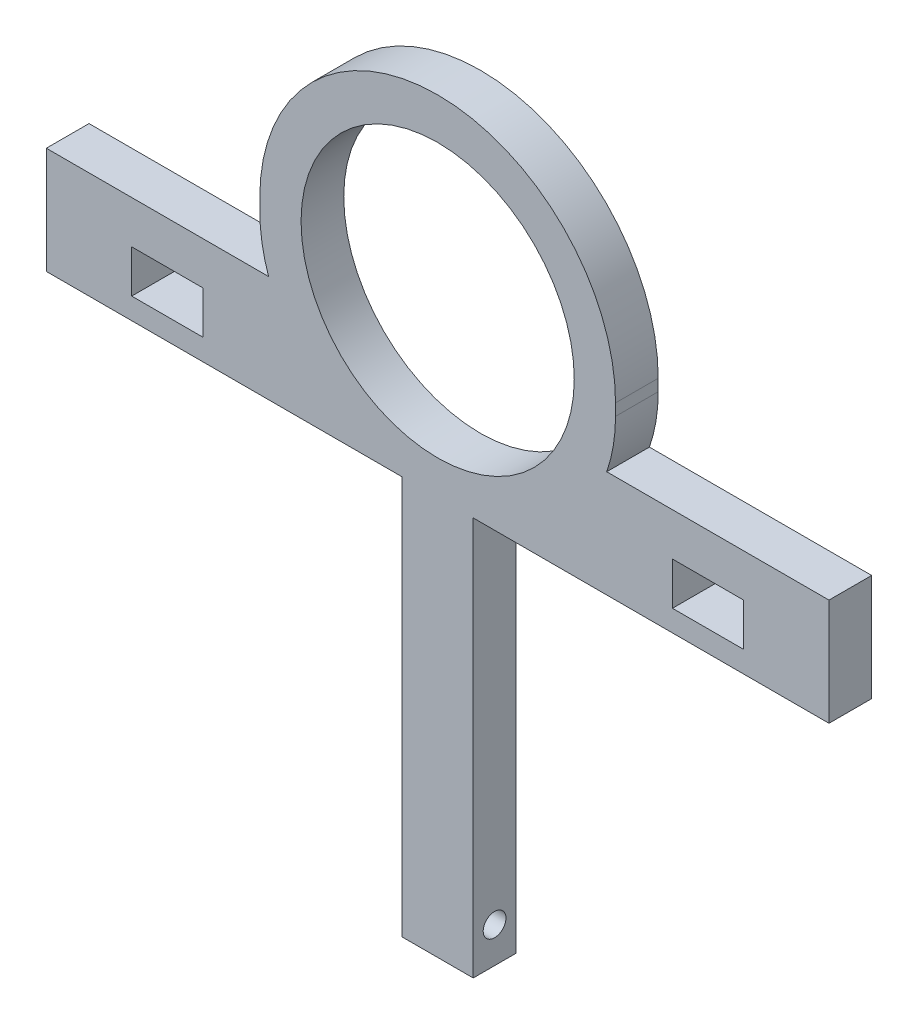
ISO-10303-21;
HEADER;
FILE_DESCRIPTION(('STEP AP214'),'2;1');
FILE_NAME('part.step','',(''),(''),'','','');
FILE_SCHEMA(('AUTOMOTIVE_DESIGN { 1 0 10303 214 1 1 1 1 }'));
ENDSEC;
DATA;
#1=APPLICATION_CONTEXT('core data for automotive mechanical design processes');
#2=APPLICATION_PROTOCOL_DEFINITION('international standard','automotive_design',2000,#1);
#3=PRODUCT_CONTEXT('',#1,'mechanical');
#4=PRODUCT('Part','Part','',(#3));
#5=PRODUCT_RELATED_PRODUCT_CATEGORY('part','',(#4));
#6=PRODUCT_DEFINITION_FORMATION('','',#4);
#7=PRODUCT_DEFINITION_CONTEXT('part definition',#1,'design');
#8=PRODUCT_DEFINITION('design','',#6,#7);
#9=PRODUCT_DEFINITION_SHAPE('','',#8);
#10=(LENGTH_UNIT() NAMED_UNIT(*) SI_UNIT(.MILLI.,.METRE.));
#11=(NAMED_UNIT(*) PLANE_ANGLE_UNIT() SI_UNIT($,.RADIAN.));
#12=(NAMED_UNIT(*) SI_UNIT($,.STERADIAN.) SOLID_ANGLE_UNIT());
#13=UNCERTAINTY_MEASURE_WITH_UNIT(LENGTH_MEASURE(1.E-05),#10,'distance_accuracy_value','');
#14=(GEOMETRIC_REPRESENTATION_CONTEXT(3) GLOBAL_UNCERTAINTY_ASSIGNED_CONTEXT((#13)) GLOBAL_UNIT_ASSIGNED_CONTEXT((#10,
#11,#12)) REPRESENTATION_CONTEXT('',''));
#15=CARTESIAN_POINT('',(0.,0.,0.));
#16=DIRECTION('',(0.,0.,1.));
#17=DIRECTION('',(1.,0.,0.));
#18=AXIS2_PLACEMENT_3D('',#15,#16,#17);
#19=CARTESIAN_POINT('',(0.,0.,7.62));
#20=DIRECTION('',(0.,0.,1.));
#21=DIRECTION('',(1.,0.,0.));
#22=AXIS2_PLACEMENT_3D('',#19,#20,#21);
#23=PLANE('',#22);
#24=DIRECTION('',(0.,-1.,0.));
#25=VECTOR('',#24,1.);
#26=CARTESIAN_POINT('',(-54.61,-26.67,7.62));
#27=LINE('',#26,#25);
#28=CARTESIAN_POINT('',(-54.61,-19.05,7.62));
#29=VERTEX_POINT('',#28);
#30=CARTESIAN_POINT('',(-54.61,-26.67,7.62));
#31=VERTEX_POINT('',#30);
#32=EDGE_CURVE('E212',#29,#31,#27,.T.);
#33=ORIENTED_EDGE('',*,*,#32,.F.);
#34=DIRECTION('',(-1.,0.,0.));
#35=VECTOR('',#34,1.);
#36=CARTESIAN_POINT('',(-54.61,-19.05,7.62));
#37=LINE('',#36,#35);
#38=CARTESIAN_POINT('',(-41.91,-19.05,7.62));
#39=VERTEX_POINT('',#38);
#40=EDGE_CURVE('E220',#39,#29,#37,.T.);
#41=ORIENTED_EDGE('',*,*,#40,.F.);
#42=DIRECTION('',(0.,1.,0.));
#43=VECTOR('',#42,1.);
#44=CARTESIAN_POINT('',(-41.91,-26.67,7.62));
#45=LINE('',#44,#43);
#46=CARTESIAN_POINT('',(-41.91,-26.67,7.62));
#47=VERTEX_POINT('',#46);
#48=EDGE_CURVE('E234',#47,#39,#45,.T.);
#49=ORIENTED_EDGE('',*,*,#48,.F.);
#50=DIRECTION('',(1.,0.,0.));
#51=VECTOR('',#50,1.);
#52=CARTESIAN_POINT('',(-54.61,-26.67,7.62));
#53=LINE('',#52,#51);
#54=EDGE_CURVE('E231',#31,#47,#53,.T.);
#55=ORIENTED_EDGE('',*,*,#54,.F.);
#56=EDGE_LOOP('',(#33,#41,#49,#55));
#57=FACE_BOUND('',#56,.T.);
#58=CARTESIAN_POINT('',(0.,0.,7.62));
#59=DIRECTION('',(0.,0.,1.));
#60=DIRECTION('',(1.,0.,0.));
#61=AXIS2_PLACEMENT_3D('',#58,#59,#60);
#62=CIRCLE('',#61,24.384);
#63=CARTESIAN_POINT('',(24.384,0.,7.62));
#64=VERTEX_POINT('',#63);
#65=EDGE_CURVE('E241',#64,#64,#62,.T.);
#66=ORIENTED_EDGE('',*,*,#65,.F.);
#67=EDGE_LOOP('',(#66));
#68=FACE_BOUND('',#67,.T.);
#69=DIRECTION('',(-1.,0.,0.));
#70=VECTOR('',#69,1.);
#71=CARTESIAN_POINT('',(69.85,-11.43,7.62));
#72=LINE('',#71,#70);
#73=CARTESIAN_POINT('',(69.85,-11.43,7.62));
#74=VERTEX_POINT('',#73);
#75=CARTESIAN_POINT('',(30.177672780168,-11.43,7.62));
#76=VERTEX_POINT('',#75);
#77=EDGE_CURVE('E271',#74,#76,#72,.T.);
#78=ORIENTED_EDGE('',*,*,#77,.T.);
#79=CARTESIAN_POINT('',(3.17500000000001,-2.08193668575268,7.62));
#80=DIRECTION('',(0.,0.,1.));
#81=DIRECTION('',(1.,0.,0.));
#82=AXIS2_PLACEMENT_3D('',#79,#80,#81);
#83=CIRCLE('',#82,28.575);
#84=CARTESIAN_POINT('',(31.75,-2.08193668575268,7.62));
#85=VERTEX_POINT('',#84);
#86=EDGE_CURVE('E352',#76,#85,#83,.T.);
#87=ORIENTED_EDGE('',*,*,#86,.T.);
#88=DIRECTION('',(0.,1.,0.));
#89=VECTOR('',#88,1.);
#90=CARTESIAN_POINT('',(31.75,0.,7.62));
#91=LINE('',#90,#89);
#92=CARTESIAN_POINT('',(31.75,0.,7.62));
#93=VERTEX_POINT('',#92);
#94=EDGE_CURVE('E330',#85,#93,#91,.T.);
#95=ORIENTED_EDGE('',*,*,#94,.T.);
#96=CARTESIAN_POINT('',(0.,0.,7.62));
#97=DIRECTION('',(0.,0.,1.));
#98=DIRECTION('',(1.,0.,0.));
#99=AXIS2_PLACEMENT_3D('',#96,#97,#98);
#100=CIRCLE('',#99,31.75);
#101=CARTESIAN_POINT('',(-31.75,0.,7.62));
#102=VERTEX_POINT('',#101);
#103=EDGE_CURVE('E345',#93,#102,#100,.T.);
#104=ORIENTED_EDGE('',*,*,#103,.T.);
#105=DIRECTION('',(0.,-1.,0.));
#106=VECTOR('',#105,1.);
#107=CARTESIAN_POINT('',(-31.75,0.,7.62));
#108=LINE('',#107,#106);
#109=CARTESIAN_POINT('',(-31.75,-2.08193668575269,7.62));
#110=VERTEX_POINT('',#109);
#111=EDGE_CURVE('E323',#102,#110,#108,.T.);
#112=ORIENTED_EDGE('',*,*,#111,.T.);
#113=CARTESIAN_POINT('',(-3.17500000000001,-2.08193668575269,7.62));
#114=DIRECTION('',(0.,0.,1.));
#115=DIRECTION('',(1.,0.,0.));
#116=AXIS2_PLACEMENT_3D('',#113,#114,#115);
#117=CIRCLE('',#116,28.575);
#118=CARTESIAN_POINT('',(-30.177672780168,-11.43,7.62));
#119=VERTEX_POINT('',#118);
#120=EDGE_CURVE('E348',#110,#119,#117,.T.);
#121=ORIENTED_EDGE('',*,*,#120,.T.);
#122=DIRECTION('',(1.,0.,0.));
#123=VECTOR('',#122,1.);
#124=CARTESIAN_POINT('',(-69.85,-11.43,7.62));
#125=LINE('',#124,#123);
#126=CARTESIAN_POINT('',(-69.85,-11.43,7.62));
#127=VERTEX_POINT('',#126);
#128=EDGE_CURVE('E298',#127,#119,#125,.T.);
#129=ORIENTED_EDGE('',*,*,#128,.F.);
#130=DIRECTION('',(0.,1.,0.));
#131=VECTOR('',#130,1.);
#132=CARTESIAN_POINT('',(-69.85,-30.48,7.62));
#133=LINE('',#132,#131);
#134=CARTESIAN_POINT('',(-69.85,-30.48,7.62));
#135=VERTEX_POINT('',#134);
#136=EDGE_CURVE('E280',#135,#127,#133,.T.);
#137=ORIENTED_EDGE('',*,*,#136,.F.);
#138=DIRECTION('',(1.,0.,0.));
#139=VECTOR('',#138,1.);
#140=CARTESIAN_POINT('',(-69.85,-30.48,7.62));
#141=LINE('',#140,#139);
#142=CARTESIAN_POINT('',(-6.35000000000002,-30.48,7.62));
#143=VERTEX_POINT('',#142);
#144=EDGE_CURVE('E289',#135,#143,#141,.T.);
#145=ORIENTED_EDGE('',*,*,#144,.T.);
#146=DIRECTION('',(0.,1.,0.));
#147=VECTOR('',#146,1.);
#148=CARTESIAN_POINT('',(-6.35000000000002,-101.6,7.62));
#149=LINE('',#148,#147);
#150=CARTESIAN_POINT('',(-6.35000000000002,-101.6,7.62));
#151=VERTEX_POINT('',#150);
#152=EDGE_CURVE('E306',#151,#143,#149,.T.);
#153=ORIENTED_EDGE('',*,*,#152,.F.);
#154=DIRECTION('',(1.,0.,0.));
#155=VECTOR('',#154,1.);
#156=CARTESIAN_POINT('',(0.,-101.6,7.62));
#157=LINE('',#156,#155);
#158=CARTESIAN_POINT('',(6.35000000000002,-101.6,7.62));
#159=VERTEX_POINT('',#158);
#160=EDGE_CURVE('E326',#151,#159,#157,.T.);
#161=ORIENTED_EDGE('',*,*,#160,.T.);
#162=DIRECTION('',(0.,-1.,0.));
#163=VECTOR('',#162,1.);
#164=CARTESIAN_POINT('',(6.35000000000002,-101.6,7.62));
#165=LINE('',#164,#163);
#166=CARTESIAN_POINT('',(6.35000000000002,-30.48,7.62));
#167=VERTEX_POINT('',#166);
#168=EDGE_CURVE('E301',#167,#159,#165,.T.);
#169=ORIENTED_EDGE('',*,*,#168,.F.);
#170=DIRECTION('',(-1.,0.,0.));
#171=VECTOR('',#170,1.);
#172=CARTESIAN_POINT('',(69.85,-30.48,7.62));
#173=LINE('',#172,#171);
#174=CARTESIAN_POINT('',(69.85,-30.48,7.62));
#175=VERTEX_POINT('',#174);
#176=EDGE_CURVE('E278',#175,#167,#173,.T.);
#177=ORIENTED_EDGE('',*,*,#176,.F.);
#178=DIRECTION('',(0.,1.,0.));
#179=VECTOR('',#178,1.);
#180=CARTESIAN_POINT('',(69.85,-30.48,7.62));
#181=LINE('',#180,#179);
#182=EDGE_CURVE('E259',#175,#74,#181,.T.);
#183=ORIENTED_EDGE('',*,*,#182,.T.);
#184=EDGE_LOOP('',(#78,#87,#95,#104,#112,#121,#129,#137,#145,#153,#161,#169,#177,#183));
#185=FACE_BOUND('',#184,.T.);
#186=DIRECTION('',(1.,0.,0.));
#187=VECTOR('',#186,1.);
#188=CARTESIAN_POINT('',(54.61,-19.05,7.62));
#189=LINE('',#188,#187);
#190=CARTESIAN_POINT('',(41.91,-19.05,7.62));
#191=VERTEX_POINT('',#190);
#192=CARTESIAN_POINT('',(54.61,-19.05,7.62));
#193=VERTEX_POINT('',#192);
#194=EDGE_CURVE('E206',#191,#193,#189,.T.);
#195=ORIENTED_EDGE('',*,*,#194,.T.);
#196=DIRECTION('',(0.,-1.,0.));
#197=VECTOR('',#196,1.);
#198=CARTESIAN_POINT('',(54.61,-26.67,7.62));
#199=LINE('',#198,#197);
#200=CARTESIAN_POINT('',(54.61,-26.67,7.62));
#201=VERTEX_POINT('',#200);
#202=EDGE_CURVE('E48',#193,#201,#199,.T.);
#203=ORIENTED_EDGE('',*,*,#202,.T.);
#204=DIRECTION('',(-1.,0.,0.));
#205=VECTOR('',#204,1.);
#206=CARTESIAN_POINT('',(54.61,-26.67,7.62));
#207=LINE('',#206,#205);
#208=CARTESIAN_POINT('',(41.91,-26.67,7.62));
#209=VERTEX_POINT('',#208);
#210=EDGE_CURVE('E197',#201,#209,#207,.T.);
#211=ORIENTED_EDGE('',*,*,#210,.T.);
#212=DIRECTION('',(0.,1.,0.));
#213=VECTOR('',#212,1.);
#214=CARTESIAN_POINT('',(41.91,-26.67,7.62));
#215=LINE('',#214,#213);
#216=EDGE_CURVE('E200',#209,#191,#215,.T.);
#217=ORIENTED_EDGE('',*,*,#216,.T.);
#218=EDGE_LOOP('',(#195,#203,#211,#217));
#219=FACE_BOUND('',#218,.T.);
#220=ADVANCED_FACE('F33',(#57,#68,#185,#219),#23,.T.);
#221=CARTESIAN_POINT('',(0.,0.,0.));
#222=DIRECTION('',(0.,0.,1.));
#223=DIRECTION('',(1.,0.,0.));
#224=AXIS2_PLACEMENT_3D('',#221,#222,#223);
#225=PLANE('',#224);
#226=CARTESIAN_POINT('',(3.17500000000001,-2.08193668575268,0.));
#227=DIRECTION('',(0.,0.,1.));
#228=DIRECTION('',(1.,0.,0.));
#229=AXIS2_PLACEMENT_3D('',#226,#227,#228);
#230=CIRCLE('',#229,28.575);
#231=CARTESIAN_POINT('',(31.75,-2.08193668575268,0.));
#232=VERTEX_POINT('',#231);
#233=CARTESIAN_POINT('',(30.177672780168,-11.43,0.));
#234=VERTEX_POINT('',#233);
#235=EDGE_CURVE('E358',#232,#234,#230,.F.);
#236=ORIENTED_EDGE('',*,*,#235,.T.);
#237=DIRECTION('',(-1.,0.,0.));
#238=VECTOR('',#237,1.);
#239=CARTESIAN_POINT('',(69.85,-11.43,0.));
#240=LINE('',#239,#238);
#241=CARTESIAN_POINT('',(69.85,-11.43,0.));
#242=VERTEX_POINT('',#241);
#243=EDGE_CURVE('E274',#242,#234,#240,.T.);
#244=ORIENTED_EDGE('',*,*,#243,.F.);
#245=DIRECTION('',(0.,-1.,0.));
#246=VECTOR('',#245,1.);
#247=CARTESIAN_POINT('',(69.85,-30.48,0.));
#248=LINE('',#247,#246);
#249=CARTESIAN_POINT('',(69.85,-30.48,0.));
#250=VERTEX_POINT('',#249);
#251=EDGE_CURVE('E265',#242,#250,#248,.T.);
#252=ORIENTED_EDGE('',*,*,#251,.T.);
#253=DIRECTION('',(-1.,0.,0.));
#254=VECTOR('',#253,1.);
#255=CARTESIAN_POINT('',(69.85,-30.48,0.));
#256=LINE('',#255,#254);
#257=CARTESIAN_POINT('',(6.35000000000002,-30.48,0.));
#258=VERTEX_POINT('',#257);
#259=EDGE_CURVE('E276',#250,#258,#256,.T.);
#260=ORIENTED_EDGE('',*,*,#259,.T.);
#261=DIRECTION('',(0.,-1.,0.));
#262=VECTOR('',#261,1.);
#263=CARTESIAN_POINT('',(6.35000000000002,-101.6,0.));
#264=LINE('',#263,#262);
#265=CARTESIAN_POINT('',(6.35000000000002,-101.6,0.));
#266=VERTEX_POINT('',#265);
#267=EDGE_CURVE('E314',#258,#266,#264,.T.);
#268=ORIENTED_EDGE('',*,*,#267,.T.);
#269=DIRECTION('',(1.,0.,0.));
#270=VECTOR('',#269,1.);
#271=CARTESIAN_POINT('',(0.,-101.6,0.));
#272=LINE('',#271,#270);
#273=CARTESIAN_POINT('',(-6.35000000000002,-101.6,0.));
#274=VERTEX_POINT('',#273);
#275=EDGE_CURVE('E335',#274,#266,#272,.T.);
#276=ORIENTED_EDGE('',*,*,#275,.F.);
#277=DIRECTION('',(0.,1.,0.));
#278=VECTOR('',#277,1.);
#279=CARTESIAN_POINT('',(-6.35000000000002,-101.6,0.));
#280=LINE('',#279,#278);
#281=CARTESIAN_POINT('',(-6.35000000000002,-30.48,0.));
#282=VERTEX_POINT('',#281);
#283=EDGE_CURVE('E302',#274,#282,#280,.T.);
#284=ORIENTED_EDGE('',*,*,#283,.T.);
#285=DIRECTION('',(1.,0.,0.));
#286=VECTOR('',#285,1.);
#287=CARTESIAN_POINT('',(-69.85,-30.48,0.));
#288=LINE('',#287,#286);
#289=CARTESIAN_POINT('',(-69.85,-30.48,0.));
#290=VERTEX_POINT('',#289);
#291=EDGE_CURVE('E292',#290,#282,#288,.T.);
#292=ORIENTED_EDGE('',*,*,#291,.F.);
#293=DIRECTION('',(0.,-1.,0.));
#294=VECTOR('',#293,1.);
#295=CARTESIAN_POINT('',(-69.85,-30.48,0.));
#296=LINE('',#295,#294);
#297=CARTESIAN_POINT('',(-69.85,-11.43,0.));
#298=VERTEX_POINT('',#297);
#299=EDGE_CURVE('E285',#298,#290,#296,.T.);
#300=ORIENTED_EDGE('',*,*,#299,.F.);
#301=DIRECTION('',(1.,0.,0.));
#302=VECTOR('',#301,1.);
#303=CARTESIAN_POINT('',(-69.85,-11.43,0.));
#304=LINE('',#303,#302);
#305=CARTESIAN_POINT('',(-30.177672780168,-11.43,0.));
#306=VERTEX_POINT('',#305);
#307=EDGE_CURVE('E295',#298,#306,#304,.T.);
#308=ORIENTED_EDGE('',*,*,#307,.T.);
#309=CARTESIAN_POINT('',(-3.17500000000001,-2.08193668575269,0.));
#310=DIRECTION('',(0.,0.,1.));
#311=DIRECTION('',(1.,0.,0.));
#312=AXIS2_PLACEMENT_3D('',#309,#310,#311);
#313=CIRCLE('',#312,28.575);
#314=CARTESIAN_POINT('',(-31.75,-2.08193668575269,0.));
#315=VERTEX_POINT('',#314);
#316=EDGE_CURVE('E356',#306,#315,#313,.F.);
#317=ORIENTED_EDGE('',*,*,#316,.T.);
#318=DIRECTION('',(0.,-1.,0.));
#319=VECTOR('',#318,1.);
#320=CARTESIAN_POINT('',(-31.75,0.,0.));
#321=LINE('',#320,#319);
#322=CARTESIAN_POINT('',(-31.75,0.,0.));
#323=VERTEX_POINT('',#322);
#324=EDGE_CURVE('E312',#323,#315,#321,.T.);
#325=ORIENTED_EDGE('',*,*,#324,.F.);
#326=CARTESIAN_POINT('',(0.,0.,0.));
#327=DIRECTION('',(0.,0.,1.));
#328=DIRECTION('',(1.,0.,0.));
#329=AXIS2_PLACEMENT_3D('',#326,#327,#328);
#330=CIRCLE('',#329,31.75);
#331=CARTESIAN_POINT('',(31.75,0.,0.));
#332=VERTEX_POINT('',#331);
#333=EDGE_CURVE('E344',#332,#323,#330,.T.);
#334=ORIENTED_EDGE('',*,*,#333,.F.);
#335=DIRECTION('',(0.,1.,0.));
#336=VECTOR('',#335,1.);
#337=CARTESIAN_POINT('',(31.75,0.,0.));
#338=LINE('',#337,#336);
#339=EDGE_CURVE('E327',#232,#332,#338,.T.);
#340=ORIENTED_EDGE('',*,*,#339,.F.);
#341=EDGE_LOOP('',(#236,#244,#252,#260,#268,#276,#284,#292,#300,#308,#317,#325,#334,#340));
#342=FACE_BOUND('',#341,.T.);
#343=CARTESIAN_POINT('',(0.,0.,0.));
#344=DIRECTION('',(0.,0.,1.));
#345=DIRECTION('',(1.,0.,0.));
#346=AXIS2_PLACEMENT_3D('',#343,#344,#345);
#347=CIRCLE('',#346,24.384);
#348=CARTESIAN_POINT('',(24.384,0.,0.));
#349=VERTEX_POINT('',#348);
#350=EDGE_CURVE('E248',#349,#349,#347,.T.);
#351=ORIENTED_EDGE('',*,*,#350,.T.);
#352=EDGE_LOOP('',(#351));
#353=FACE_BOUND('',#352,.T.);
#354=DIRECTION('',(-1.,0.,0.));
#355=VECTOR('',#354,1.);
#356=CARTESIAN_POINT('',(-54.61,-19.05,0.));
#357=LINE('',#356,#355);
#358=CARTESIAN_POINT('',(-41.91,-19.05,0.));
#359=VERTEX_POINT('',#358);
#360=CARTESIAN_POINT('',(-54.61,-19.05,0.));
#361=VERTEX_POINT('',#360);
#362=EDGE_CURVE('E226',#359,#361,#357,.T.);
#363=ORIENTED_EDGE('',*,*,#362,.T.);
#364=DIRECTION('',(0.,-1.,0.));
#365=VECTOR('',#364,1.);
#366=CARTESIAN_POINT('',(-54.61,-26.67,0.));
#367=LINE('',#366,#365);
#368=CARTESIAN_POINT('',(-54.61,-26.67,0.));
#369=VERTEX_POINT('',#368);
#370=EDGE_CURVE('E216',#361,#369,#367,.T.);
#371=ORIENTED_EDGE('',*,*,#370,.T.);
#372=DIRECTION('',(1.,0.,0.));
#373=VECTOR('',#372,1.);
#374=CARTESIAN_POINT('',(-54.61,-26.67,0.));
#375=LINE('',#374,#373);
#376=CARTESIAN_POINT('',(-41.91,-26.67,0.));
#377=VERTEX_POINT('',#376);
#378=EDGE_CURVE('E219',#369,#377,#375,.T.);
#379=ORIENTED_EDGE('',*,*,#378,.T.);
#380=DIRECTION('',(0.,1.,0.));
#381=VECTOR('',#380,1.);
#382=CARTESIAN_POINT('',(-41.91,-26.67,0.));
#383=LINE('',#382,#381);
#384=EDGE_CURVE('E223',#377,#359,#383,.T.);
#385=ORIENTED_EDGE('',*,*,#384,.T.);
#386=EDGE_LOOP('',(#363,#371,#379,#385));
#387=FACE_BOUND('',#386,.T.);
#388=DIRECTION('',(0.,-1.,0.));
#389=VECTOR('',#388,1.);
#390=CARTESIAN_POINT('',(54.61,-26.67,0.));
#391=LINE('',#390,#389);
#392=CARTESIAN_POINT('',(54.61,-19.05,0.));
#393=VERTEX_POINT('',#392);
#394=CARTESIAN_POINT('',(54.61,-26.67,0.));
#395=VERTEX_POINT('',#394);
#396=EDGE_CURVE('E189',#393,#395,#391,.T.);
#397=ORIENTED_EDGE('',*,*,#396,.F.);
#398=DIRECTION('',(1.,0.,0.));
#399=VECTOR('',#398,1.);
#400=CARTESIAN_POINT('',(54.61,-19.05,0.));
#401=LINE('',#400,#399);
#402=CARTESIAN_POINT('',(41.91,-19.05,0.));
#403=VERTEX_POINT('',#402);
#404=EDGE_CURVE('E181',#403,#393,#401,.T.);
#405=ORIENTED_EDGE('',*,*,#404,.F.);
#406=DIRECTION('',(0.,1.,0.));
#407=VECTOR('',#406,1.);
#408=CARTESIAN_POINT('',(41.91,-26.67,0.));
#409=LINE('',#408,#407);
#410=CARTESIAN_POINT('',(41.91,-26.67,0.));
#411=VERTEX_POINT('',#410);
#412=EDGE_CURVE('E188',#411,#403,#409,.T.);
#413=ORIENTED_EDGE('',*,*,#412,.F.);
#414=DIRECTION('',(-1.,0.,0.));
#415=VECTOR('',#414,1.);
#416=CARTESIAN_POINT('',(54.61,-26.67,0.));
#417=LINE('',#416,#415);
#418=EDGE_CURVE('E193',#395,#411,#417,.T.);
#419=ORIENTED_EDGE('',*,*,#418,.F.);
#420=EDGE_LOOP('',(#397,#405,#413,#419));
#421=FACE_BOUND('',#420,.T.);
#422=ADVANCED_FACE('F196',(#342,#353,#387,#421),#225,.F.);
#423=CARTESIAN_POINT('',(-3.17500000000001,-2.08193668575269,0.));
#424=DIRECTION('',(0.,0.,-1.));
#425=DIRECTION('',(-1.,0.,0.));
#426=AXIS2_PLACEMENT_3D('',#423,#424,#425);
#427=CYLINDRICAL_SURFACE('',#426,28.575);
#428=ORIENTED_EDGE('',*,*,#316,.F.);
#429=DIRECTION('',(0.,0.,-1.));
#430=VECTOR('',#429,1.);
#431=CARTESIAN_POINT('',(-30.177672780168,-11.43,0.));
#432=LINE('',#431,#430);
#433=EDGE_CURVE('E41',#306,#119,#432,.F.);
#434=ORIENTED_EDGE('',*,*,#433,.T.);
#435=ORIENTED_EDGE('',*,*,#120,.F.);
#436=DIRECTION('',(0.,0.,-1.));
#437=VECTOR('',#436,1.);
#438=CARTESIAN_POINT('',(-31.75,-2.08193668575269,7.62));
#439=LINE('',#438,#437);
#440=EDGE_CURVE('E361',#315,#110,#439,.F.);
#441=ORIENTED_EDGE('',*,*,#440,.F.);
#442=EDGE_LOOP('',(#428,#434,#435,#441));
#443=FACE_BOUND('',#442,.T.);
#444=ADVANCED_FACE('F35',(#443),#427,.T.);
#445=CARTESIAN_POINT('',(0.,0.,7.62));
#446=DIRECTION('',(0.,0.,-1.));
#447=DIRECTION('',(-1.,0.,0.));
#448=AXIS2_PLACEMENT_3D('',#445,#446,#447);
#449=CYLINDRICAL_SURFACE('',#448,31.75);
#450=DIRECTION('',(0.,0.,-1.));
#451=VECTOR('',#450,1.);
#452=CARTESIAN_POINT('',(-31.75,0.,7.62));
#453=LINE('',#452,#451);
#454=EDGE_CURVE('E332',#102,#323,#453,.T.);
#455=ORIENTED_EDGE('',*,*,#454,.F.);
#456=ORIENTED_EDGE('',*,*,#103,.F.);
#457=DIRECTION('',(0.,0.,-1.));
#458=VECTOR('',#457,1.);
#459=CARTESIAN_POINT('',(31.75,0.,7.62));
#460=LINE('',#459,#458);
#461=EDGE_CURVE('E341',#93,#332,#460,.T.);
#462=ORIENTED_EDGE('',*,*,#461,.T.);
#463=ORIENTED_EDGE('',*,*,#333,.T.);
#464=EDGE_LOOP('',(#455,#456,#462,#463));
#465=FACE_BOUND('',#464,.T.);
#466=ADVANCED_FACE('F421',(#465),#449,.T.);
#467=CARTESIAN_POINT('',(-31.75,0.,7.62));
#468=DIRECTION('',(1.,0.,0.));
#469=DIRECTION('',(0.,1.,0.));
#470=AXIS2_PLACEMENT_3D('',#467,#468,#469);
#471=PLANE('',#470);
#472=ORIENTED_EDGE('',*,*,#324,.T.);
#473=ORIENTED_EDGE('',*,*,#440,.T.);
#474=ORIENTED_EDGE('',*,*,#111,.F.);
#475=ORIENTED_EDGE('',*,*,#454,.T.);
#476=EDGE_LOOP('',(#472,#473,#474,#475));
#477=FACE_BOUND('',#476,.T.);
#478=ADVANCED_FACE('F423',(#477),#471,.F.);
#479=CARTESIAN_POINT('',(0.,-101.6,7.62));
#480=DIRECTION('',(0.,1.,0.));
#481=DIRECTION('',(0.,0.,1.));
#482=AXIS2_PLACEMENT_3D('',#479,#480,#481);
#483=PLANE('',#482);
#484=ORIENTED_EDGE('',*,*,#160,.F.);
#485=DIRECTION('',(0.,0.,1.));
#486=VECTOR('',#485,1.);
#487=CARTESIAN_POINT('',(-6.35000000000002,-101.6,0.));
#488=LINE('',#487,#486);
#489=EDGE_CURVE('E305',#274,#151,#488,.T.);
#490=ORIENTED_EDGE('',*,*,#489,.F.);
#491=ORIENTED_EDGE('',*,*,#275,.T.);
#492=DIRECTION('',(0.,0.,1.));
#493=VECTOR('',#492,1.);
#494=CARTESIAN_POINT('',(6.35000000000002,-101.6,0.));
#495=LINE('',#494,#493);
#496=EDGE_CURVE('E308',#266,#159,#495,.T.);
#497=ORIENTED_EDGE('',*,*,#496,.T.);
#498=EDGE_LOOP('',(#484,#490,#491,#497));
#499=FACE_BOUND('',#498,.T.);
#500=ADVANCED_FACE('F392',(#499),#483,.F.);
#501=CARTESIAN_POINT('',(31.75,0.,7.62));
#502=DIRECTION('',(-1.,0.,0.));
#503=DIRECTION('',(0.,-1.,0.));
#504=AXIS2_PLACEMENT_3D('',#501,#502,#503);
#505=PLANE('',#504);
#506=ORIENTED_EDGE('',*,*,#94,.F.);
#507=DIRECTION('',(0.,0.,1.));
#508=VECTOR('',#507,1.);
#509=CARTESIAN_POINT('',(31.75,-2.08193668575268,7.62));
#510=LINE('',#509,#508);
#511=EDGE_CURVE('E354',#85,#232,#510,.F.);
#512=ORIENTED_EDGE('',*,*,#511,.T.);
#513=ORIENTED_EDGE('',*,*,#339,.T.);
#514=ORIENTED_EDGE('',*,*,#461,.F.);
#515=EDGE_LOOP('',(#506,#512,#513,#514));
#516=FACE_BOUND('',#515,.T.);
#517=ADVANCED_FACE('F418',(#516),#505,.F.);
#518=CARTESIAN_POINT('',(6.35000000000002,-101.6,0.));
#519=DIRECTION('',(-1.,0.,0.));
#520=DIRECTION('',(0.,0.,1.));
#521=AXIS2_PLACEMENT_3D('',#518,#519,#520);
#522=PLANE('',#521);
#523=CARTESIAN_POINT('',(6.35000000000002,-95.25,3.81));
#524=DIRECTION('',(-1.,0.,0.));
#525=DIRECTION('',(0.,0.,1.));
#526=AXIS2_PLACEMENT_3D('',#523,#524,#525);
#527=CIRCLE('',#526,2.032);
#528=CARTESIAN_POINT('',(6.35000000000002,-95.25,5.842));
#529=VERTEX_POINT('',#528);
#530=EDGE_CURVE('E256',#529,#529,#527,.T.);
#531=ORIENTED_EDGE('',*,*,#530,.T.);
#532=EDGE_LOOP('',(#531));
#533=FACE_BOUND('',#532,.T.);
#534=ORIENTED_EDGE('',*,*,#168,.T.);
#535=ORIENTED_EDGE('',*,*,#496,.F.);
#536=ORIENTED_EDGE('',*,*,#267,.F.);
#537=DIRECTION('',(0.,0.,1.));
#538=VECTOR('',#537,1.);
#539=CARTESIAN_POINT('',(6.35000000000002,-30.48,0.));
#540=LINE('',#539,#538);
#541=EDGE_CURVE('E317',#258,#167,#540,.T.);
#542=ORIENTED_EDGE('',*,*,#541,.T.);
#543=EDGE_LOOP('',(#534,#535,#536,#542));
#544=FACE_BOUND('',#543,.T.);
#545=ADVANCED_FACE('F396',(#533,#544),#522,.F.);
#546=CARTESIAN_POINT('',(-6.35000000000002,-101.6,0.));
#547=DIRECTION('',(1.,0.,0.));
#548=DIRECTION('',(0.,0.,-1.));
#549=AXIS2_PLACEMENT_3D('',#546,#547,#548);
#550=PLANE('',#549);
#551=CARTESIAN_POINT('',(-6.35000000000002,-95.25,3.81));
#552=DIRECTION('',(-1.,0.,0.));
#553=DIRECTION('',(0.,0.,1.));
#554=AXIS2_PLACEMENT_3D('',#551,#552,#553);
#555=CIRCLE('',#554,2.032);
#556=CARTESIAN_POINT('',(-6.35000000000002,-95.25,5.842));
#557=VERTEX_POINT('',#556);
#558=EDGE_CURVE('E251',#557,#557,#555,.T.);
#559=ORIENTED_EDGE('',*,*,#558,.F.);
#560=EDGE_LOOP('',(#559));
#561=FACE_BOUND('',#560,.T.);
#562=ORIENTED_EDGE('',*,*,#152,.T.);
#563=DIRECTION('',(0.,0.,1.));
#564=VECTOR('',#563,1.);
#565=CARTESIAN_POINT('',(-6.35000000000002,-30.48,0.));
#566=LINE('',#565,#564);
#567=EDGE_CURVE('E309',#282,#143,#566,.T.);
#568=ORIENTED_EDGE('',*,*,#567,.F.);
#569=ORIENTED_EDGE('',*,*,#283,.F.);
#570=ORIENTED_EDGE('',*,*,#489,.T.);
#571=EDGE_LOOP('',(#562,#568,#569,#570));
#572=FACE_BOUND('',#571,.T.);
#573=ADVANCED_FACE('F385',(#561,#572),#550,.F.);
#574=CARTESIAN_POINT('',(3.17500000000001,-2.08193668575268,0.));
#575=DIRECTION('',(0.,0.,1.));
#576=DIRECTION('',(1.,0.,0.));
#577=AXIS2_PLACEMENT_3D('',#574,#575,#576);
#578=CYLINDRICAL_SURFACE('',#577,28.575);
#579=DIRECTION('',(0.,0.,1.));
#580=VECTOR('',#579,1.);
#581=CARTESIAN_POINT('',(30.177672780168,-11.43,0.));
#582=LINE('',#581,#580);
#583=EDGE_CURVE('E11',#234,#76,#582,.T.);
#584=ORIENTED_EDGE('',*,*,#583,.F.);
#585=ORIENTED_EDGE('',*,*,#235,.F.);
#586=ORIENTED_EDGE('',*,*,#511,.F.);
#587=ORIENTED_EDGE('',*,*,#86,.F.);
#588=EDGE_LOOP('',(#584,#585,#586,#587));
#589=FACE_BOUND('',#588,.T.);
#590=ADVANCED_FACE('F412',(#589),#578,.T.);
#591=CARTESIAN_POINT('',(-69.85,-11.43,7.62));
#592=DIRECTION('',(0.,-1.,0.));
#593=DIRECTION('',(0.,0.,-1.));
#594=AXIS2_PLACEMENT_3D('',#591,#592,#593);
#595=PLANE('',#594);
#596=ORIENTED_EDGE('',*,*,#433,.F.);
#597=ORIENTED_EDGE('',*,*,#307,.F.);
#598=DIRECTION('',(0.,0.,-1.));
#599=VECTOR('',#598,1.);
#600=CARTESIAN_POINT('',(-69.85,-11.43,7.62));
#601=LINE('',#600,#599);
#602=EDGE_CURVE('E283',#127,#298,#601,.T.);
#603=ORIENTED_EDGE('',*,*,#602,.F.);
#604=ORIENTED_EDGE('',*,*,#128,.T.);
#605=EDGE_LOOP('',(#596,#597,#603,#604));
#606=FACE_BOUND('',#605,.T.);
#607=ADVANCED_FACE('F373',(#606),#595,.F.);
#608=CARTESIAN_POINT('',(-69.85,-30.48,7.62));
#609=DIRECTION('',(0.,1.,0.));
#610=DIRECTION('',(0.,0.,1.));
#611=AXIS2_PLACEMENT_3D('',#608,#609,#610);
#612=PLANE('',#611);
#613=ORIENTED_EDGE('',*,*,#567,.T.);
#614=ORIENTED_EDGE('',*,*,#144,.F.);
#615=DIRECTION('',(0.,0.,1.));
#616=VECTOR('',#615,1.);
#617=CARTESIAN_POINT('',(-69.85,-30.48,7.62));
#618=LINE('',#617,#616);
#619=EDGE_CURVE('E287',#290,#135,#618,.T.);
#620=ORIENTED_EDGE('',*,*,#619,.F.);
#621=ORIENTED_EDGE('',*,*,#291,.T.);
#622=EDGE_LOOP('',(#613,#614,#620,#621));
#623=FACE_BOUND('',#622,.T.);
#624=ADVANCED_FACE('F382',(#623),#612,.F.);
#625=CARTESIAN_POINT('',(-69.85,0.,0.));
#626=DIRECTION('',(-1.,0.,0.));
#627=DIRECTION('',(0.,0.,1.));
#628=AXIS2_PLACEMENT_3D('',#625,#626,#627);
#629=PLANE('',#628);
#630=ORIENTED_EDGE('',*,*,#136,.T.);
#631=ORIENTED_EDGE('',*,*,#602,.T.);
#632=ORIENTED_EDGE('',*,*,#299,.T.);
#633=ORIENTED_EDGE('',*,*,#619,.T.);
#634=EDGE_LOOP('',(#630,#631,#632,#633));
#635=FACE_BOUND('',#634,.T.);
#636=ADVANCED_FACE('F376',(#635),#629,.T.);
#637=CARTESIAN_POINT('',(69.85,-30.48,7.62));
#638=DIRECTION('',(0.,-1.,0.));
#639=DIRECTION('',(0.,0.,-1.));
#640=AXIS2_PLACEMENT_3D('',#637,#638,#639);
#641=PLANE('',#640);
#642=ORIENTED_EDGE('',*,*,#541,.F.);
#643=ORIENTED_EDGE('',*,*,#259,.F.);
#644=DIRECTION('',(0.,0.,1.));
#645=VECTOR('',#644,1.);
#646=CARTESIAN_POINT('',(69.85,-30.48,7.62));
#647=LINE('',#646,#645);
#648=EDGE_CURVE('E262',#250,#175,#647,.T.);
#649=ORIENTED_EDGE('',*,*,#648,.T.);
#650=ORIENTED_EDGE('',*,*,#176,.T.);
#651=EDGE_LOOP('',(#642,#643,#649,#650));
#652=FACE_BOUND('',#651,.T.);
#653=ADVANCED_FACE('F399',(#652),#641,.T.);
#654=CARTESIAN_POINT('',(69.85,-11.43,7.62));
#655=DIRECTION('',(0.,1.,0.));
#656=DIRECTION('',(0.,0.,1.));
#657=AXIS2_PLACEMENT_3D('',#654,#655,#656);
#658=PLANE('',#657);
#659=ORIENTED_EDGE('',*,*,#243,.T.);
#660=ORIENTED_EDGE('',*,*,#583,.T.);
#661=ORIENTED_EDGE('',*,*,#77,.F.);
#662=DIRECTION('',(0.,0.,-1.));
#663=VECTOR('',#662,1.);
#664=CARTESIAN_POINT('',(69.85,-11.43,7.62));
#665=LINE('',#664,#663);
#666=EDGE_CURVE('E268',#74,#242,#665,.T.);
#667=ORIENTED_EDGE('',*,*,#666,.T.);
#668=EDGE_LOOP('',(#659,#660,#661,#667));
#669=FACE_BOUND('',#668,.T.);
#670=ADVANCED_FACE('F409',(#669),#658,.T.);
#671=CARTESIAN_POINT('',(69.85,0.,0.));
#672=DIRECTION('',(1.,0.,0.));
#673=DIRECTION('',(0.,0.,1.));
#674=AXIS2_PLACEMENT_3D('',#671,#672,#673);
#675=PLANE('',#674);
#676=ORIENTED_EDGE('',*,*,#182,.F.);
#677=ORIENTED_EDGE('',*,*,#648,.F.);
#678=ORIENTED_EDGE('',*,*,#251,.F.);
#679=ORIENTED_EDGE('',*,*,#666,.F.);
#680=EDGE_LOOP('',(#676,#677,#678,#679));
#681=FACE_BOUND('',#680,.T.);
#682=ADVANCED_FACE('F403',(#681),#675,.T.);
#683=CARTESIAN_POINT('',(69.85,-95.25,3.81));
#684=DIRECTION('',(-1.,0.,0.));
#685=DIRECTION('',(0.,0.,1.));
#686=AXIS2_PLACEMENT_3D('',#683,#684,#685);
#687=CYLINDRICAL_SURFACE('',#686,2.032);
#688=ORIENTED_EDGE('',*,*,#558,.T.);
#689=EDGE_LOOP('',(#688));
#690=FACE_BOUND('',#689,.T.);
#691=ORIENTED_EDGE('',*,*,#530,.F.);
#692=EDGE_LOOP('',(#691));
#693=FACE_BOUND('',#692,.T.);
#694=ADVANCED_FACE('F483',(#690,#693),#687,.F.);
#695=CARTESIAN_POINT('',(0.,0.,0.));
#696=DIRECTION('',(0.,0.,1.));
#697=DIRECTION('',(1.,0.,0.));
#698=AXIS2_PLACEMENT_3D('',#695,#696,#697);
#699=CYLINDRICAL_SURFACE('',#698,24.384);
#700=CARTESIAN_POINT('',(24.384,0.,0.));
#701=CARTESIAN_POINT('',(24.384,0.,0.0793749999999998));
#702=CARTESIAN_POINT('',(24.384,0.,0.15875));
#703=CARTESIAN_POINT('',(24.384,0.,0.3175));
#704=CARTESIAN_POINT('',(24.384,0.,0.396875));
#705=CARTESIAN_POINT('',(24.384,0.,0.555625));
#706=CARTESIAN_POINT('',(24.384,0.,0.635));
#707=CARTESIAN_POINT('',(24.384,0.,0.79375));
#708=CARTESIAN_POINT('',(24.384,0.,0.873125));
#709=CARTESIAN_POINT('',(24.384,0.,1.031875));
#710=CARTESIAN_POINT('',(24.384,0.,1.11125));
#711=CARTESIAN_POINT('',(24.384,0.,1.27));
#712=CARTESIAN_POINT('',(24.384,0.,1.349375));
#713=CARTESIAN_POINT('',(24.384,0.,1.508125));
#714=CARTESIAN_POINT('',(24.384,0.,1.5875));
#715=CARTESIAN_POINT('',(24.384,0.,1.74625));
#716=CARTESIAN_POINT('',(24.384,0.,1.825625));
#717=CARTESIAN_POINT('',(24.384,0.,1.984375));
#718=CARTESIAN_POINT('',(24.384,0.,2.06375));
#719=CARTESIAN_POINT('',(24.384,0.,2.2225));
#720=CARTESIAN_POINT('',(24.384,0.,2.301875));
#721=CARTESIAN_POINT('',(24.384,0.,2.460625));
#722=CARTESIAN_POINT('',(24.384,0.,2.54));
#723=CARTESIAN_POINT('',(24.384,0.,2.69875));
#724=CARTESIAN_POINT('',(24.384,0.,2.778125));
#725=CARTESIAN_POINT('',(24.384,0.,2.936875));
#726=CARTESIAN_POINT('',(24.384,0.,3.01625));
#727=CARTESIAN_POINT('',(24.384,0.,3.175));
#728=CARTESIAN_POINT('',(24.384,0.,3.254375));
#729=CARTESIAN_POINT('',(24.384,0.,3.413125));
#730=CARTESIAN_POINT('',(24.384,0.,3.4925));
#731=CARTESIAN_POINT('',(24.384,0.,3.65125));
#732=CARTESIAN_POINT('',(24.384,0.,3.730625));
#733=CARTESIAN_POINT('',(24.384,0.,3.889375));
#734=CARTESIAN_POINT('',(24.384,0.,3.96875));
#735=CARTESIAN_POINT('',(24.384,0.,4.1275));
#736=CARTESIAN_POINT('',(24.384,0.,4.206875));
#737=CARTESIAN_POINT('',(24.384,0.,4.365625));
#738=CARTESIAN_POINT('',(24.384,0.,4.445));
#739=CARTESIAN_POINT('',(24.384,0.,4.60375));
#740=CARTESIAN_POINT('',(24.384,0.,4.683125));
#741=CARTESIAN_POINT('',(24.384,0.,4.841875));
#742=CARTESIAN_POINT('',(24.384,0.,4.92125));
#743=CARTESIAN_POINT('',(24.384,0.,5.08));
#744=CARTESIAN_POINT('',(24.384,0.,5.159375));
#745=CARTESIAN_POINT('',(24.384,0.,5.318125));
#746=CARTESIAN_POINT('',(24.384,0.,5.3975));
#747=CARTESIAN_POINT('',(24.384,0.,5.55625));
#748=CARTESIAN_POINT('',(24.384,0.,5.635625));
#749=CARTESIAN_POINT('',(24.384,0.,5.794375));
#750=CARTESIAN_POINT('',(24.384,0.,5.87375));
#751=CARTESIAN_POINT('',(24.384,0.,6.0325));
#752=CARTESIAN_POINT('',(24.384,0.,6.111875));
#753=CARTESIAN_POINT('',(24.384,0.,6.270625));
#754=CARTESIAN_POINT('',(24.384,0.,6.35));
#755=CARTESIAN_POINT('',(24.384,0.,6.50875));
#756=CARTESIAN_POINT('',(24.384,0.,6.588125));
#757=CARTESIAN_POINT('',(24.384,0.,6.746875));
#758=CARTESIAN_POINT('',(24.384,0.,6.82625));
#759=CARTESIAN_POINT('',(24.384,0.,6.985));
#760=CARTESIAN_POINT('',(24.384,0.,7.064375));
#761=CARTESIAN_POINT('',(24.384,0.,7.223125));
#762=CARTESIAN_POINT('',(24.384,0.,7.3025));
#763=CARTESIAN_POINT('',(24.384,0.,7.46125));
#764=CARTESIAN_POINT('',(24.384,0.,7.540625));
#765=CARTESIAN_POINT('',(24.384,0.,7.62));
#766=B_SPLINE_CURVE_WITH_KNOTS('',3,(#700,#701,#702,#703,#704,#705,#706,#707,#708,#709,#710,
#711,#712,#713,#714,#715,#716,#717,#718,#719,#720,#721,#722,#723,#724,#725,#726,#727,#728,#729,
#730,#731,#732,#733,#734,#735,#736,#737,#738,#739,#740,#741,#742,#743,#744,#745,#746,#747,#748,
#749,#750,#751,#752,#753,#754,#755,#756,#757,#758,#759,#760,#761,#762,#763,#764,#765),
.UNSPECIFIED.,.F.,.F.,(4,2,2,2,2,2,2,2,2,2,2,2,2,2,2,2,2,2,2,2,2,2,2,2,2,2,2,2,2,2,2,2,4),(0.,
0.238125,0.47625,0.714375,0.9525,1.190625,1.42875,1.666875,1.905,2.143125,2.38125,2.619375,
2.8575,3.095625,3.33375,3.571875,3.81,4.048125,4.28625,4.524375,4.7625,5.000625,5.23875,
5.476875,5.715,5.953125,6.19125,6.429375,6.6675,6.905625,7.14375,7.381875,7.62),.UNSPECIFIED.);
#767=EDGE_CURVE('BSEAM488',#349,#64,#766,.T.);
#768=ORIENTED_EDGE('',*,*,#350,.F.);
#769=ORIENTED_EDGE('',*,*,#65,.T.);
#770=ORIENTED_EDGE('',*,*,#767,.T.);
#771=ORIENTED_EDGE('',*,*,#767,.F.);
#772=EDGE_LOOP('',(#768,#770,#769,#771));
#773=FACE_BOUND('',#772,.T.);
#774=ADVANCED_FACE('F488',(#773),#699,.F.);
#775=CARTESIAN_POINT('',(-54.61,-26.67,0.));
#776=DIRECTION('',(-1.,0.,0.));
#777=DIRECTION('',(0.,0.,1.));
#778=AXIS2_PLACEMENT_3D('',#775,#776,#777);
#779=PLANE('',#778);
#780=ORIENTED_EDGE('',*,*,#32,.T.);
#781=DIRECTION('',(0.,0.,1.));
#782=VECTOR('',#781,1.);
#783=CARTESIAN_POINT('',(-54.61,-26.67,0.));
#784=LINE('',#783,#782);
#785=EDGE_CURVE('E229',#369,#31,#784,.T.);
#786=ORIENTED_EDGE('',*,*,#785,.F.);
#787=ORIENTED_EDGE('',*,*,#370,.F.);
#788=DIRECTION('',(0.,0.,1.));
#789=VECTOR('',#788,1.);
#790=CARTESIAN_POINT('',(-54.61,-19.05,0.));
#791=LINE('',#790,#789);
#792=EDGE_CURVE('E239',#361,#29,#791,.T.);
#793=ORIENTED_EDGE('',*,*,#792,.T.);
#794=EDGE_LOOP('',(#780,#786,#787,#793));
#795=FACE_BOUND('',#794,.T.);
#796=ADVANCED_FACE('F498',(#795),#779,.F.);
#797=CARTESIAN_POINT('',(-54.61,-19.05,0.));
#798=DIRECTION('',(0.,1.,0.));
#799=DIRECTION('',(0.,0.,1.));
#800=AXIS2_PLACEMENT_3D('',#797,#798,#799);
#801=PLANE('',#800);
#802=ORIENTED_EDGE('',*,*,#40,.T.);
#803=ORIENTED_EDGE('',*,*,#792,.F.);
#804=ORIENTED_EDGE('',*,*,#362,.F.);
#805=DIRECTION('',(0.,0.,1.));
#806=VECTOR('',#805,1.);
#807=CARTESIAN_POINT('',(-41.91,-19.05,0.));
#808=LINE('',#807,#806);
#809=EDGE_CURVE('E242',#359,#39,#808,.T.);
#810=ORIENTED_EDGE('',*,*,#809,.T.);
#811=EDGE_LOOP('',(#802,#803,#804,#810));
#812=FACE_BOUND('',#811,.T.);
#813=ADVANCED_FACE('F508',(#812),#801,.F.);
#814=CARTESIAN_POINT('',(-41.91,-26.67,0.));
#815=DIRECTION('',(1.,0.,0.));
#816=DIRECTION('',(0.,0.,-1.));
#817=AXIS2_PLACEMENT_3D('',#814,#815,#816);
#818=PLANE('',#817);
#819=ORIENTED_EDGE('',*,*,#48,.T.);
#820=ORIENTED_EDGE('',*,*,#809,.F.);
#821=ORIENTED_EDGE('',*,*,#384,.F.);
#822=DIRECTION('',(0.,0.,1.));
#823=VECTOR('',#822,1.);
#824=CARTESIAN_POINT('',(-41.91,-26.67,0.));
#825=LINE('',#824,#823);
#826=EDGE_CURVE('E244',#377,#47,#825,.T.);
#827=ORIENTED_EDGE('',*,*,#826,.T.);
#828=EDGE_LOOP('',(#819,#820,#821,#827));
#829=FACE_BOUND('',#828,.T.);
#830=ADVANCED_FACE('F518',(#829),#818,.F.);
#831=CARTESIAN_POINT('',(-54.61,-26.67,0.));
#832=DIRECTION('',(0.,-1.,0.));
#833=DIRECTION('',(0.,0.,-1.));
#834=AXIS2_PLACEMENT_3D('',#831,#832,#833);
#835=PLANE('',#834);
#836=ORIENTED_EDGE('',*,*,#54,.T.);
#837=ORIENTED_EDGE('',*,*,#826,.F.);
#838=ORIENTED_EDGE('',*,*,#378,.F.);
#839=ORIENTED_EDGE('',*,*,#785,.T.);
#840=EDGE_LOOP('',(#836,#837,#838,#839));
#841=FACE_BOUND('',#840,.T.);
#842=ADVANCED_FACE('F528',(#841),#835,.F.);
#843=CARTESIAN_POINT('',(54.61,-26.67,0.));
#844=DIRECTION('',(-1.,0.,0.));
#845=DIRECTION('',(0.,0.,1.));
#846=AXIS2_PLACEMENT_3D('',#843,#844,#845);
#847=PLANE('',#846);
#848=ORIENTED_EDGE('',*,*,#202,.F.);
#849=DIRECTION('',(0.,0.,1.));
#850=VECTOR('',#849,1.);
#851=CARTESIAN_POINT('',(54.61,-19.05,0.));
#852=LINE('',#851,#850);
#853=EDGE_CURVE('E183',#393,#193,#852,.T.);
#854=ORIENTED_EDGE('',*,*,#853,.F.);
#855=ORIENTED_EDGE('',*,*,#396,.T.);
#856=DIRECTION('',(0.,0.,1.));
#857=VECTOR('',#856,1.);
#858=CARTESIAN_POINT('',(54.61,-26.67,0.));
#859=LINE('',#858,#857);
#860=EDGE_CURVE('E210',#395,#201,#859,.T.);
#861=ORIENTED_EDGE('',*,*,#860,.T.);
#862=EDGE_LOOP('',(#848,#854,#855,#861));
#863=FACE_BOUND('',#862,.T.);
#864=ADVANCED_FACE('F191',(#863),#847,.T.);
#865=CARTESIAN_POINT('',(54.61,-26.67,0.));
#866=DIRECTION('',(0.,1.,0.));
#867=DIRECTION('',(0.,0.,1.));
#868=AXIS2_PLACEMENT_3D('',#865,#866,#867);
#869=PLANE('',#868);
#870=ORIENTED_EDGE('',*,*,#210,.F.);
#871=ORIENTED_EDGE('',*,*,#860,.F.);
#872=ORIENTED_EDGE('',*,*,#418,.T.);
#873=DIRECTION('',(0.,0.,1.));
#874=VECTOR('',#873,1.);
#875=CARTESIAN_POINT('',(41.91,-26.67,0.));
#876=LINE('',#875,#874);
#877=EDGE_CURVE('E213',#411,#209,#876,.T.);
#878=ORIENTED_EDGE('',*,*,#877,.T.);
#879=EDGE_LOOP('',(#870,#871,#872,#878));
#880=FACE_BOUND('',#879,.T.);
#881=ADVANCED_FACE('F562',(#880),#869,.T.);
#882=CARTESIAN_POINT('',(41.91,-26.67,0.));
#883=DIRECTION('',(1.,0.,0.));
#884=DIRECTION('',(0.,0.,-1.));
#885=AXIS2_PLACEMENT_3D('',#882,#883,#884);
#886=PLANE('',#885);
#887=ORIENTED_EDGE('',*,*,#216,.F.);
#888=ORIENTED_EDGE('',*,*,#877,.F.);
#889=ORIENTED_EDGE('',*,*,#412,.T.);
#890=DIRECTION('',(0.,0.,1.));
#891=VECTOR('',#890,1.);
#892=CARTESIAN_POINT('',(41.91,-19.05,0.));
#893=LINE('',#892,#891);
#894=EDGE_CURVE('E56',#403,#191,#893,.T.);
#895=ORIENTED_EDGE('',*,*,#894,.T.);
#896=EDGE_LOOP('',(#887,#888,#889,#895));
#897=FACE_BOUND('',#896,.T.);
#898=ADVANCED_FACE('F571',(#897),#886,.T.);
#899=CARTESIAN_POINT('',(54.61,-19.05,0.));
#900=DIRECTION('',(0.,-1.,0.));
#901=DIRECTION('',(0.,0.,-1.));
#902=AXIS2_PLACEMENT_3D('',#899,#900,#901);
#903=PLANE('',#902);
#904=ORIENTED_EDGE('',*,*,#194,.F.);
#905=ORIENTED_EDGE('',*,*,#894,.F.);
#906=ORIENTED_EDGE('',*,*,#404,.T.);
#907=ORIENTED_EDGE('',*,*,#853,.T.);
#908=EDGE_LOOP('',(#904,#905,#906,#907));
#909=FACE_BOUND('',#908,.T.);
#910=ADVANCED_FACE('F182',(#909),#903,.T.);
#911=CLOSED_SHELL('',(#220,#422,#444,#466,#478,#500,#517,#545,#573,#590,#607,#624,#636,#653,
#670,#682,#694,#774,#796,#813,#830,#842,#864,#881,#898,#910));
#912=MANIFOLD_SOLID_BREP('B2',#911);
#913=ADVANCED_BREP_SHAPE_REPRESENTATION('',(#18,#912),#14);
#914=SHAPE_DEFINITION_REPRESENTATION(#9,#913);
ENDSEC;
END-ISO-10303-21;
